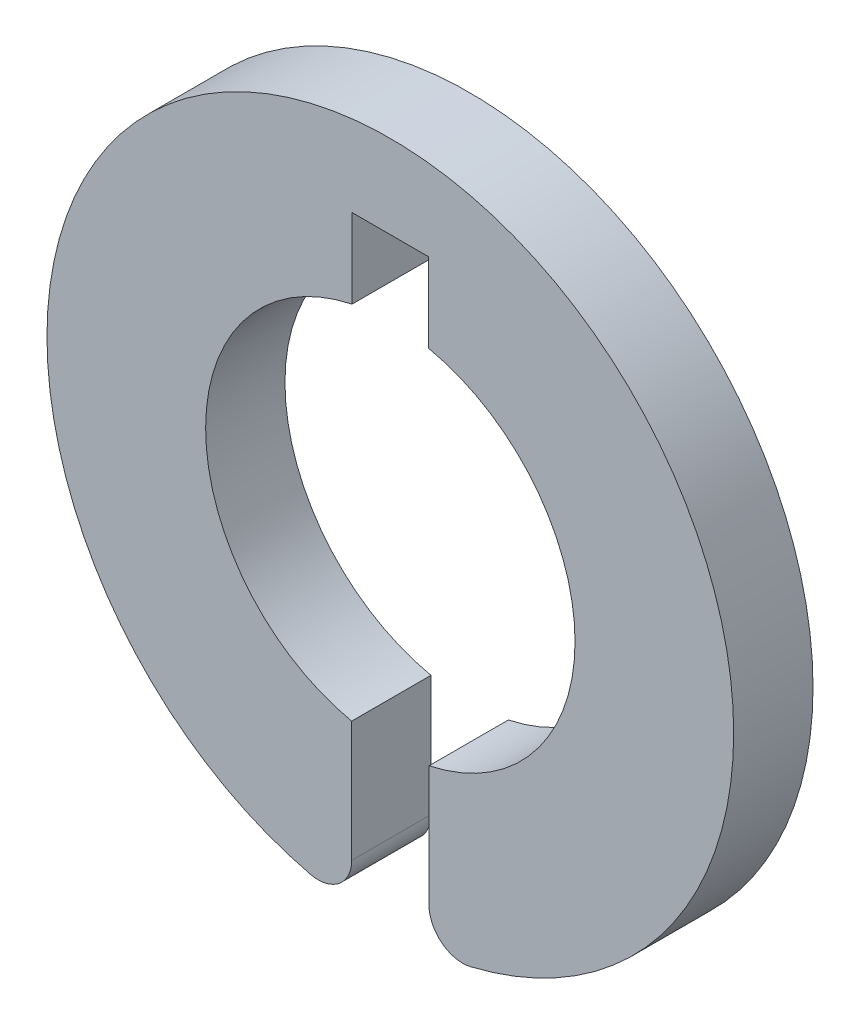
ISO-10303-21;
HEADER;
FILE_DESCRIPTION(('STEP AP214'),'2;1');
FILE_NAME('part.step','',(''),(''),'','','');
FILE_SCHEMA(('AUTOMOTIVE_DESIGN { 1 0 10303 214 1 1 1 1 }'));
ENDSEC;
DATA;
#1=APPLICATION_CONTEXT('core data for automotive mechanical design processes');
#2=APPLICATION_PROTOCOL_DEFINITION('international standard','automotive_design',2000,#1);
#3=PRODUCT_CONTEXT('',#1,'mechanical');
#4=PRODUCT('Part','Part','',(#3));
#5=PRODUCT_RELATED_PRODUCT_CATEGORY('part','',(#4));
#6=PRODUCT_DEFINITION_FORMATION('','',#4);
#7=PRODUCT_DEFINITION_CONTEXT('part definition',#1,'design');
#8=PRODUCT_DEFINITION('design','',#6,#7);
#9=PRODUCT_DEFINITION_SHAPE('','',#8);
#10=(LENGTH_UNIT() NAMED_UNIT(*) SI_UNIT(.MILLI.,.METRE.));
#11=(NAMED_UNIT(*) PLANE_ANGLE_UNIT() SI_UNIT($,.RADIAN.));
#12=(NAMED_UNIT(*) SI_UNIT($,.STERADIAN.) SOLID_ANGLE_UNIT());
#13=UNCERTAINTY_MEASURE_WITH_UNIT(LENGTH_MEASURE(1.E-05),#10,'distance_accuracy_value','');
#14=(GEOMETRIC_REPRESENTATION_CONTEXT(3) GLOBAL_UNCERTAINTY_ASSIGNED_CONTEXT((#13)) GLOBAL_UNIT_ASSIGNED_CONTEXT((#10,
#11,#12)) REPRESENTATION_CONTEXT('',''));
#15=CARTESIAN_POINT('',(0.,0.,0.));
#16=DIRECTION('',(0.,0.,1.));
#17=DIRECTION('',(1.,0.,0.));
#18=AXIS2_PLACEMENT_3D('',#15,#16,#17);
#19=CARTESIAN_POINT('',(0.,0.,3.));
#20=DIRECTION('',(0.,0.,-1.));
#21=DIRECTION('',(-1.,0.,0.));
#22=AXIS2_PLACEMENT_3D('',#19,#20,#21);
#23=CYLINDRICAL_SURFACE('',#22,6.985);
#24=CARTESIAN_POINT('',(0.,0.,0.));
#25=DIRECTION('',(0.,0.,-1.));
#26=DIRECTION('',(1.,0.,0.));
#27=AXIS2_PLACEMENT_3D('',#24,#25,#26);
#28=CIRCLE('',#27,6.985);
#29=CARTESIAN_POINT('',(1.4475,6.83337169704678,0.));
#30=VERTEX_POINT('',#29);
#31=CARTESIAN_POINT('',(1.4625,-6.8301770657868,0.));
#32=VERTEX_POINT('',#31);
#33=EDGE_CURVE('E138',#30,#32,#28,.T.);
#34=ORIENTED_EDGE('',*,*,#33,.T.);
#35=DIRECTION('',(0.,0.,-1.));
#36=VECTOR('',#35,1.);
#37=CARTESIAN_POINT('',(1.4625,-6.8301770657868,3.));
#38=LINE('',#37,#36);
#39=CARTESIAN_POINT('',(1.4625,-6.8301770657868,3.));
#40=VERTEX_POINT('',#39);
#41=EDGE_CURVE('E118',#40,#32,#38,.T.);
#42=ORIENTED_EDGE('',*,*,#41,.F.);
#43=CARTESIAN_POINT('',(0.,0.,3.));
#44=DIRECTION('',(0.,0.,-1.));
#45=DIRECTION('',(1.,0.,0.));
#46=AXIS2_PLACEMENT_3D('',#43,#44,#45);
#47=CIRCLE('',#46,6.985);
#48=CARTESIAN_POINT('',(1.4475,6.83337169704678,3.));
#49=VERTEX_POINT('',#48);
#50=EDGE_CURVE('E123',#49,#40,#47,.T.);
#51=ORIENTED_EDGE('',*,*,#50,.F.);
#52=DIRECTION('',(0.,0.,-1.));
#53=VECTOR('',#52,1.);
#54=CARTESIAN_POINT('',(1.4475,6.83337169704678,3.));
#55=LINE('',#54,#53);
#56=EDGE_CURVE('E189',#49,#30,#55,.T.);
#57=ORIENTED_EDGE('',*,*,#56,.T.);
#58=EDGE_LOOP('',(#34,#42,#51,#57));
#59=FACE_BOUND('',#58,.T.);
#60=ADVANCED_FACE('F39',(#59),#23,.F.);
#61=CARTESIAN_POINT('',(1.4625,-12.9023764768356,3.));
#62=DIRECTION('',(1.,0.,0.));
#63=DIRECTION('',(0.,0.,-1.));
#64=AXIS2_PLACEMENT_3D('',#61,#62,#63);
#65=PLANE('',#64);
#66=DIRECTION('',(0.,-1.,0.));
#67=VECTOR('',#66,1.);
#68=CARTESIAN_POINT('',(1.4625,-12.9023764768356,0.));
#69=LINE('',#68,#67);
#70=CARTESIAN_POINT('',(1.4625,-11.3918685363728,0.));
#71=VERTEX_POINT('',#70);
#72=EDGE_CURVE('E177',#32,#71,#69,.T.);
#73=ORIENTED_EDGE('',*,*,#72,.T.);
#74=DIRECTION('',(0.,0.,-1.));
#75=VECTOR('',#74,1.);
#76=CARTESIAN_POINT('',(1.4625,-11.3918685363728,3.));
#77=LINE('',#76,#75);
#78=CARTESIAN_POINT('',(1.4625,-11.3918685363728,3.));
#79=VERTEX_POINT('',#78);
#80=EDGE_CURVE('E11',#71,#79,#77,.F.);
#81=ORIENTED_EDGE('',*,*,#80,.T.);
#82=DIRECTION('',(0.,-1.,0.));
#83=VECTOR('',#82,1.);
#84=CARTESIAN_POINT('',(1.4625,-12.9023764768356,3.));
#85=LINE('',#84,#83);
#86=EDGE_CURVE('E113',#40,#79,#85,.T.);
#87=ORIENTED_EDGE('',*,*,#86,.F.);
#88=ORIENTED_EDGE('',*,*,#41,.T.);
#89=EDGE_LOOP('',(#73,#81,#87,#88));
#90=FACE_BOUND('',#89,.T.);
#91=ADVANCED_FACE('F120',(#90),#65,.F.);
#92=CARTESIAN_POINT('',(0.,0.,3.));
#93=DIRECTION('',(0.,0.,-1.));
#94=DIRECTION('',(-1.,0.,0.));
#95=AXIS2_PLACEMENT_3D('',#92,#93,#94);
#96=CYLINDRICAL_SURFACE('',#95,12.985);
#97=CARTESIAN_POINT('',(0.,0.,0.));
#98=DIRECTION('',(0.,0.,1.));
#99=DIRECTION('',(-1.,0.,0.));
#100=AXIS2_PLACEMENT_3D('',#97,#98,#99);
#101=CIRCLE('',#100,12.985);
#102=CARTESIAN_POINT('',(3.02872492530943,-12.6268384929407,0.));
#103=VERTEX_POINT('',#102);
#104=CARTESIAN_POINT('',(-3.02872492530943,-12.6268384929407,0.));
#105=VERTEX_POINT('',#104);
#106=EDGE_CURVE('E175',#103,#105,#101,.T.);
#107=ORIENTED_EDGE('',*,*,#106,.T.);
#108=DIRECTION('',(0.,0.,-1.));
#109=VECTOR('',#108,1.);
#110=CARTESIAN_POINT('',(-3.02872492530943,-12.6268384929407,3.));
#111=LINE('',#110,#109);
#112=CARTESIAN_POINT('',(-3.02872492530943,-12.6268384929407,3.));
#113=VERTEX_POINT('',#112);
#114=EDGE_CURVE('E58',#105,#113,#111,.F.);
#115=ORIENTED_EDGE('',*,*,#114,.T.);
#116=CARTESIAN_POINT('',(0.,0.,3.));
#117=DIRECTION('',(0.,0.,1.));
#118=DIRECTION('',(-1.,0.,0.));
#119=AXIS2_PLACEMENT_3D('',#116,#117,#118);
#120=CIRCLE('',#119,12.985);
#121=CARTESIAN_POINT('',(3.02872492530943,-12.6268384929407,3.));
#122=VERTEX_POINT('',#121);
#123=EDGE_CURVE('E124',#122,#113,#120,.T.);
#124=ORIENTED_EDGE('',*,*,#123,.F.);
#125=DIRECTION('',(0.,0.,-1.));
#126=VECTOR('',#125,1.);
#127=CARTESIAN_POINT('',(3.02872492530943,-12.6268384929407,3.));
#128=LINE('',#127,#126);
#129=EDGE_CURVE('E151',#122,#103,#128,.T.);
#130=ORIENTED_EDGE('',*,*,#129,.T.);
#131=EDGE_LOOP('',(#107,#115,#124,#130));
#132=FACE_BOUND('',#131,.T.);
#133=ADVANCED_FACE('F174',(#132),#96,.T.);
#134=CARTESIAN_POINT('',(-1.4625,-12.9023764768356,3.));
#135=DIRECTION('',(-1.,0.,0.));
#136=DIRECTION('',(0.,0.,1.));
#137=AXIS2_PLACEMENT_3D('',#134,#135,#136);
#138=PLANE('',#137);
#139=DIRECTION('',(0.,1.,0.));
#140=VECTOR('',#139,1.);
#141=CARTESIAN_POINT('',(-1.4625,-12.9023764768356,3.));
#142=LINE('',#141,#140);
#143=CARTESIAN_POINT('',(-1.4625,-11.3918685363728,3.));
#144=VERTEX_POINT('',#143);
#145=CARTESIAN_POINT('',(-1.4625,-6.8301770657868,3.));
#146=VERTEX_POINT('',#145);
#147=EDGE_CURVE('E158',#144,#146,#142,.T.);
#148=ORIENTED_EDGE('',*,*,#147,.F.);
#149=DIRECTION('',(0.,0.,-1.));
#150=VECTOR('',#149,1.);
#151=CARTESIAN_POINT('',(-1.4625,-11.3918685363728,3.));
#152=LINE('',#151,#150);
#153=CARTESIAN_POINT('',(-1.4625,-11.3918685363728,0.));
#154=VERTEX_POINT('',#153);
#155=EDGE_CURVE('E139',#144,#154,#152,.T.);
#156=ORIENTED_EDGE('',*,*,#155,.T.);
#157=DIRECTION('',(0.,1.,0.));
#158=VECTOR('',#157,1.);
#159=CARTESIAN_POINT('',(-1.4625,-12.9023764768356,0.));
#160=LINE('',#159,#158);
#161=CARTESIAN_POINT('',(-1.4625,-6.8301770657868,0.));
#162=VERTEX_POINT('',#161);
#163=EDGE_CURVE('E173',#154,#162,#160,.T.);
#164=ORIENTED_EDGE('',*,*,#163,.T.);
#165=DIRECTION('',(0.,0.,-1.));
#166=VECTOR('',#165,1.);
#167=CARTESIAN_POINT('',(-1.4625,-6.8301770657868,3.));
#168=LINE('',#167,#166);
#169=EDGE_CURVE('E137',#146,#162,#168,.T.);
#170=ORIENTED_EDGE('',*,*,#169,.F.);
#171=EDGE_LOOP('',(#148,#156,#164,#170));
#172=FACE_BOUND('',#171,.T.);
#173=ADVANCED_FACE('F162',(#172),#138,.F.);
#174=CARTESIAN_POINT('',(0.,0.,3.));
#175=DIRECTION('',(0.,0.,-1.));
#176=DIRECTION('',(-1.,0.,0.));
#177=AXIS2_PLACEMENT_3D('',#174,#175,#176);
#178=CYLINDRICAL_SURFACE('',#177,6.985);
#179=CARTESIAN_POINT('',(0.,0.,0.));
#180=DIRECTION('',(0.,0.,-1.));
#181=DIRECTION('',(1.,0.,0.));
#182=AXIS2_PLACEMENT_3D('',#179,#180,#181);
#183=CIRCLE('',#182,6.985);
#184=CARTESIAN_POINT('',(-1.4475,6.83337169704678,0.));
#185=VERTEX_POINT('',#184);
#186=EDGE_CURVE('E178',#162,#185,#183,.T.);
#187=ORIENTED_EDGE('',*,*,#186,.T.);
#188=DIRECTION('',(0.,0.,-1.));
#189=VECTOR('',#188,1.);
#190=CARTESIAN_POINT('',(-1.4475,6.83337169704678,3.));
#191=LINE('',#190,#189);
#192=CARTESIAN_POINT('',(-1.4475,6.83337169704678,3.));
#193=VERTEX_POINT('',#192);
#194=EDGE_CURVE('E145',#193,#185,#191,.T.);
#195=ORIENTED_EDGE('',*,*,#194,.F.);
#196=CARTESIAN_POINT('',(0.,0.,3.));
#197=DIRECTION('',(0.,0.,-1.));
#198=DIRECTION('',(1.,0.,0.));
#199=AXIS2_PLACEMENT_3D('',#196,#197,#198);
#200=CIRCLE('',#199,6.985);
#201=EDGE_CURVE('E167',#146,#193,#200,.T.);
#202=ORIENTED_EDGE('',*,*,#201,.F.);
#203=ORIENTED_EDGE('',*,*,#169,.T.);
#204=EDGE_LOOP('',(#187,#195,#202,#203));
#205=FACE_BOUND('',#204,.T.);
#206=ADVANCED_FACE('F219',(#205),#178,.F.);
#207=CARTESIAN_POINT('',(-1.4475,9.83337169704678,3.));
#208=DIRECTION('',(-1.,0.,0.));
#209=DIRECTION('',(0.,-1.,0.));
#210=AXIS2_PLACEMENT_3D('',#207,#208,#209);
#211=PLANE('',#210);
#212=DIRECTION('',(0.,1.,0.));
#213=VECTOR('',#212,1.);
#214=CARTESIAN_POINT('',(-1.4475,9.83337169704678,0.));
#215=LINE('',#214,#213);
#216=CARTESIAN_POINT('',(-1.4475,9.83337169704678,0.));
#217=VERTEX_POINT('',#216);
#218=EDGE_CURVE('E183',#185,#217,#215,.T.);
#219=ORIENTED_EDGE('',*,*,#218,.T.);
#220=DIRECTION('',(0.,0.,-1.));
#221=VECTOR('',#220,1.);
#222=CARTESIAN_POINT('',(-1.4475,9.83337169704678,3.));
#223=LINE('',#222,#221);
#224=CARTESIAN_POINT('',(-1.4475,9.83337169704678,3.));
#225=VERTEX_POINT('',#224);
#226=EDGE_CURVE('E191',#225,#217,#223,.T.);
#227=ORIENTED_EDGE('',*,*,#226,.F.);
#228=DIRECTION('',(0.,1.,0.));
#229=VECTOR('',#228,1.);
#230=CARTESIAN_POINT('',(-1.4475,9.83337169704678,3.));
#231=LINE('',#230,#229);
#232=EDGE_CURVE('E204',#193,#225,#231,.T.);
#233=ORIENTED_EDGE('',*,*,#232,.F.);
#234=ORIENTED_EDGE('',*,*,#194,.T.);
#235=EDGE_LOOP('',(#219,#227,#233,#234));
#236=FACE_BOUND('',#235,.T.);
#237=ADVANCED_FACE('F205',(#236),#211,.F.);
#238=CARTESIAN_POINT('',(-1.4475,9.83337169704678,3.));
#239=DIRECTION('',(0.,1.,0.));
#240=DIRECTION('',(0.,0.,1.));
#241=AXIS2_PLACEMENT_3D('',#238,#239,#240);
#242=PLANE('',#241);
#243=DIRECTION('',(1.,0.,0.));
#244=VECTOR('',#243,1.);
#245=CARTESIAN_POINT('',(-1.4475,9.83337169704678,0.));
#246=LINE('',#245,#244);
#247=CARTESIAN_POINT('',(1.4475,9.83337169704678,0.));
#248=VERTEX_POINT('',#247);
#249=EDGE_CURVE('E190',#217,#248,#246,.T.);
#250=ORIENTED_EDGE('',*,*,#249,.T.);
#251=DIRECTION('',(0.,0.,-1.));
#252=VECTOR('',#251,1.);
#253=CARTESIAN_POINT('',(1.4475,9.83337169704678,3.));
#254=LINE('',#253,#252);
#255=CARTESIAN_POINT('',(1.4475,9.83337169704678,3.));
#256=VERTEX_POINT('',#255);
#257=EDGE_CURVE('E194',#256,#248,#254,.T.);
#258=ORIENTED_EDGE('',*,*,#257,.F.);
#259=DIRECTION('',(1.,0.,0.));
#260=VECTOR('',#259,1.);
#261=CARTESIAN_POINT('',(-1.4475,9.83337169704678,3.));
#262=LINE('',#261,#260);
#263=EDGE_CURVE('E212',#225,#256,#262,.T.);
#264=ORIENTED_EDGE('',*,*,#263,.F.);
#265=ORIENTED_EDGE('',*,*,#226,.T.);
#266=EDGE_LOOP('',(#250,#258,#264,#265));
#267=FACE_BOUND('',#266,.T.);
#268=ADVANCED_FACE('F209',(#267),#242,.F.);
#269=CARTESIAN_POINT('',(1.4475,9.83337169704678,3.));
#270=DIRECTION('',(1.,0.,0.));
#271=DIRECTION('',(0.,1.,0.));
#272=AXIS2_PLACEMENT_3D('',#269,#270,#271);
#273=PLANE('',#272);
#274=DIRECTION('',(0.,-1.,0.));
#275=VECTOR('',#274,1.);
#276=CARTESIAN_POINT('',(1.4475,9.83337169704678,0.));
#277=LINE('',#276,#275);
#278=EDGE_CURVE('E132',#248,#30,#277,.T.);
#279=ORIENTED_EDGE('',*,*,#278,.T.);
#280=ORIENTED_EDGE('',*,*,#56,.F.);
#281=DIRECTION('',(0.,-1.,0.));
#282=VECTOR('',#281,1.);
#283=CARTESIAN_POINT('',(1.4475,9.83337169704678,3.));
#284=LINE('',#283,#282);
#285=EDGE_CURVE('E129',#256,#49,#284,.T.);
#286=ORIENTED_EDGE('',*,*,#285,.F.);
#287=ORIENTED_EDGE('',*,*,#257,.T.);
#288=EDGE_LOOP('',(#279,#280,#286,#287));
#289=FACE_BOUND('',#288,.T.);
#290=ADVANCED_FACE('F213',(#289),#273,.F.);
#291=CARTESIAN_POINT('',(0.,0.,3.));
#292=DIRECTION('',(0.,0.,1.));
#293=DIRECTION('',(1.,0.,0.));
#294=AXIS2_PLACEMENT_3D('',#291,#292,#293);
#295=PLANE('',#294);
#296=ORIENTED_EDGE('',*,*,#123,.T.);
#297=CARTESIAN_POINT('',(-2.7325,-11.3918685363728,3.));
#298=DIRECTION('',(0.,0.,1.));
#299=DIRECTION('',(1.,0.,0.));
#300=AXIS2_PLACEMENT_3D('',#297,#298,#299);
#301=CIRCLE('',#300,1.27);
#302=EDGE_CURVE('E50',#113,#144,#301,.T.);
#303=ORIENTED_EDGE('',*,*,#302,.T.);
#304=ORIENTED_EDGE('',*,*,#147,.T.);
#305=ORIENTED_EDGE('',*,*,#201,.T.);
#306=ORIENTED_EDGE('',*,*,#232,.T.);
#307=ORIENTED_EDGE('',*,*,#263,.T.);
#308=ORIENTED_EDGE('',*,*,#285,.T.);
#309=ORIENTED_EDGE('',*,*,#50,.T.);
#310=ORIENTED_EDGE('',*,*,#86,.T.);
#311=CARTESIAN_POINT('',(2.7325,-11.3918685363728,3.));
#312=DIRECTION('',(0.,0.,1.));
#313=DIRECTION('',(1.,0.,0.));
#314=AXIS2_PLACEMENT_3D('',#311,#312,#313);
#315=CIRCLE('',#314,1.27);
#316=EDGE_CURVE('E154',#79,#122,#315,.T.);
#317=ORIENTED_EDGE('',*,*,#316,.T.);
#318=EDGE_LOOP('',(#296,#303,#304,#305,#306,#307,#308,#309,#310,#317));
#319=FACE_BOUND('',#318,.T.);
#320=ADVANCED_FACE('F130',(#319),#295,.T.);
#321=CARTESIAN_POINT('',(0.,0.,0.));
#322=DIRECTION('',(0.,0.,1.));
#323=DIRECTION('',(1.,0.,0.));
#324=AXIS2_PLACEMENT_3D('',#321,#322,#323);
#325=PLANE('',#324);
#326=ORIENTED_EDGE('',*,*,#163,.F.);
#327=CARTESIAN_POINT('',(-2.7325,-11.3918685363728,0.));
#328=DIRECTION('',(0.,0.,1.));
#329=DIRECTION('',(1.,0.,0.));
#330=AXIS2_PLACEMENT_3D('',#327,#328,#329);
#331=CIRCLE('',#330,1.27);
#332=EDGE_CURVE('E149',#154,#105,#331,.F.);
#333=ORIENTED_EDGE('',*,*,#332,.T.);
#334=ORIENTED_EDGE('',*,*,#106,.F.);
#335=CARTESIAN_POINT('',(2.7325,-11.3918685363728,0.));
#336=DIRECTION('',(0.,0.,1.));
#337=DIRECTION('',(1.,0.,0.));
#338=AXIS2_PLACEMENT_3D('',#335,#336,#337);
#339=CIRCLE('',#338,1.27);
#340=EDGE_CURVE('E143',#103,#71,#339,.F.);
#341=ORIENTED_EDGE('',*,*,#340,.T.);
#342=ORIENTED_EDGE('',*,*,#72,.F.);
#343=ORIENTED_EDGE('',*,*,#33,.F.);
#344=ORIENTED_EDGE('',*,*,#278,.F.);
#345=ORIENTED_EDGE('',*,*,#249,.F.);
#346=ORIENTED_EDGE('',*,*,#218,.F.);
#347=ORIENTED_EDGE('',*,*,#186,.F.);
#348=EDGE_LOOP('',(#326,#333,#334,#341,#342,#343,#344,#345,#346,#347));
#349=FACE_BOUND('',#348,.T.);
#350=ADVANCED_FACE('F171',(#349),#325,.F.);
#351=CARTESIAN_POINT('',(-2.7325,-11.3918685363728,3.));
#352=DIRECTION('',(0.,0.,-1.));
#353=DIRECTION('',(-1.,0.,0.));
#354=AXIS2_PLACEMENT_3D('',#351,#352,#353);
#355=CYLINDRICAL_SURFACE('',#354,1.27);
#356=ORIENTED_EDGE('',*,*,#302,.F.);
#357=ORIENTED_EDGE('',*,*,#114,.F.);
#358=ORIENTED_EDGE('',*,*,#332,.F.);
#359=ORIENTED_EDGE('',*,*,#155,.F.);
#360=EDGE_LOOP('',(#356,#357,#358,#359));
#361=FACE_BOUND('',#360,.T.);
#362=ADVANCED_FACE('F169',(#361),#355,.T.);
#363=CARTESIAN_POINT('',(2.7325,-11.3918685363728,3.));
#364=DIRECTION('',(0.,0.,-1.));
#365=DIRECTION('',(-1.,0.,0.));
#366=AXIS2_PLACEMENT_3D('',#363,#364,#365);
#367=CYLINDRICAL_SURFACE('',#366,1.27);
#368=ORIENTED_EDGE('',*,*,#316,.F.);
#369=ORIENTED_EDGE('',*,*,#80,.F.);
#370=ORIENTED_EDGE('',*,*,#340,.F.);
#371=ORIENTED_EDGE('',*,*,#129,.F.);
#372=EDGE_LOOP('',(#368,#369,#370,#371));
#373=FACE_BOUND('',#372,.T.);
#374=ADVANCED_FACE('F41',(#373),#367,.T.);
#375=CLOSED_SHELL('',(#60,#91,#133,#173,#206,#237,#268,#290,#320,#350,#362,#374));
#376=MANIFOLD_SOLID_BREP('B2',#375);
#377=ADVANCED_BREP_SHAPE_REPRESENTATION('',(#18,#376),#14);
#378=SHAPE_DEFINITION_REPRESENTATION(#9,#377);
ENDSEC;
END-ISO-10303-21;
